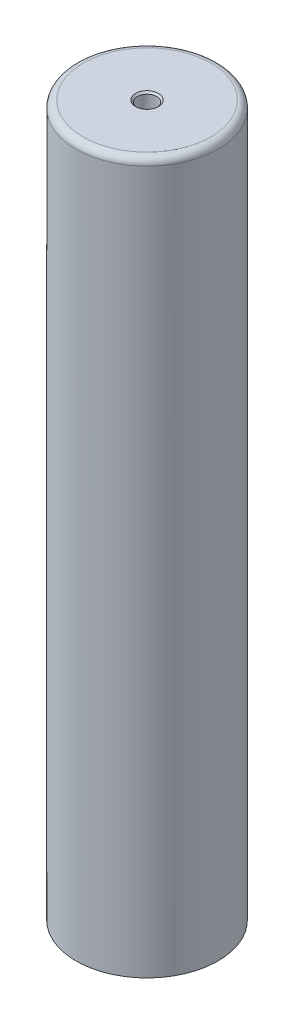
ISO-10303-21;
HEADER;
FILE_DESCRIPTION(('STEP AP214'),'2;1');
FILE_NAME('part.step','',(''),(''),'','','');
FILE_SCHEMA(('AUTOMOTIVE_DESIGN { 1 0 10303 214 1 1 1 1 }'));
ENDSEC;
DATA;
#1=APPLICATION_CONTEXT('core data for automotive mechanical design processes');
#2=APPLICATION_PROTOCOL_DEFINITION('international standard','automotive_design',2000,#1);
#3=PRODUCT_CONTEXT('',#1,'mechanical');
#4=PRODUCT('Part','Part','',(#3));
#5=PRODUCT_RELATED_PRODUCT_CATEGORY('part','',(#4));
#6=PRODUCT_DEFINITION_FORMATION('','',#4);
#7=PRODUCT_DEFINITION_CONTEXT('part definition',#1,'design');
#8=PRODUCT_DEFINITION('design','',#6,#7);
#9=PRODUCT_DEFINITION_SHAPE('','',#8);
#10=(LENGTH_UNIT() NAMED_UNIT(*) SI_UNIT(.MILLI.,.METRE.));
#11=(NAMED_UNIT(*) PLANE_ANGLE_UNIT() SI_UNIT($,.RADIAN.));
#12=(NAMED_UNIT(*) SI_UNIT($,.STERADIAN.) SOLID_ANGLE_UNIT());
#13=UNCERTAINTY_MEASURE_WITH_UNIT(LENGTH_MEASURE(1.E-05),#10,'distance_accuracy_value','');
#14=(GEOMETRIC_REPRESENTATION_CONTEXT(3) GLOBAL_UNCERTAINTY_ASSIGNED_CONTEXT((#13)) GLOBAL_UNIT_ASSIGNED_CONTEXT((#10,
#11,#12)) REPRESENTATION_CONTEXT('',''));
#15=CARTESIAN_POINT('',(0.,0.,0.));
#16=DIRECTION('',(0.,0.,1.));
#17=DIRECTION('',(1.,0.,0.));
#18=AXIS2_PLACEMENT_3D('',#15,#16,#17);
#19=CARTESIAN_POINT('',(0.,250.,0.));
#20=DIRECTION('',(0.,1.,0.));
#21=DIRECTION('',(0.,0.,1.));
#22=AXIS2_PLACEMENT_3D('',#19,#20,#21);
#23=PLANE('',#22);
#24=CARTESIAN_POINT('',(0.,250.,0.));
#25=DIRECTION('',(0.,1.,0.));
#26=DIRECTION('',(0.,0.,1.));
#27=AXIS2_PLACEMENT_3D('',#24,#25,#26);
#28=CIRCLE('',#27,22.4999999999999);
#29=CARTESIAN_POINT('',(0.,250.,22.4999999999999));
#30=VERTEX_POINT('',#29);
#31=EDGE_CURVE('E11',#30,#30,#28,.T.);
#32=ORIENTED_EDGE('',*,*,#31,.T.);
#33=EDGE_LOOP('',(#32));
#34=FACE_BOUND('',#33,.T.);
#35=CARTESIAN_POINT('',(0.,250.,0.));
#36=DIRECTION('',(0.,1.,0.));
#37=DIRECTION('',(0.,0.,1.));
#38=AXIS2_PLACEMENT_3D('',#35,#36,#37);
#39=CIRCLE('',#38,4.025);
#40=CARTESIAN_POINT('',(0.,250.,4.025));
#41=VERTEX_POINT('',#40);
#42=EDGE_CURVE('E65',#41,#41,#39,.T.);
#43=ORIENTED_EDGE('',*,*,#42,.F.);
#44=EDGE_LOOP('',(#43));
#45=FACE_BOUND('',#44,.T.);
#46=ADVANCED_FACE('F39',(#34,#45),#23,.T.);
#47=CARTESIAN_POINT('',(0.,0.,0.));
#48=DIRECTION('',(0.,-1.,0.));
#49=DIRECTION('',(0.,0.,-1.));
#50=AXIS2_PLACEMENT_3D('',#47,#48,#49);
#51=CYLINDRICAL_SURFACE('',#50,24.9999999999999);
#52=CARTESIAN_POINT('',(0.,247.5,0.));
#53=DIRECTION('',(0.,1.,0.));
#54=DIRECTION('',(0.,0.,1.));
#55=AXIS2_PLACEMENT_3D('',#52,#53,#54);
#56=CIRCLE('',#55,24.9999999999999);
#57=CARTESIAN_POINT('',(0.,247.5,24.9999999999999));
#58=VERTEX_POINT('',#57);
#59=EDGE_CURVE('E46',#58,#58,#56,.F.);
#60=ORIENTED_EDGE('',*,*,#59,.T.);
#61=EDGE_LOOP('',(#60));
#62=FACE_BOUND('',#61,.T.);
#63=CARTESIAN_POINT('',(0.,0.,0.));
#64=DIRECTION('',(0.,-1.,0.));
#65=DIRECTION('',(0.,0.,-1.));
#66=AXIS2_PLACEMENT_3D('',#63,#64,#65);
#67=CIRCLE('',#66,24.9999999999998);
#68=CARTESIAN_POINT('',(0.,0.,-24.9999999999998));
#69=VERTEX_POINT('',#68);
#70=EDGE_CURVE('E59',#69,#69,#67,.T.);
#71=ORIENTED_EDGE('',*,*,#70,.F.);
#72=EDGE_LOOP('',(#71));
#73=FACE_BOUND('',#72,.T.);
#74=ADVANCED_FACE('F71',(#62,#73),#51,.T.);
#75=CARTESIAN_POINT('',(24.9999999999998,0.,0.));
#76=DIRECTION('',(0.,-1.,0.));
#77=DIRECTION('',(0.,0.,-1.));
#78=AXIS2_PLACEMENT_3D('',#75,#76,#77);
#79=PLANE('',#78);
#80=ORIENTED_EDGE('',*,*,#70,.T.);
#81=EDGE_LOOP('',(#80));
#82=FACE_BOUND('',#81,.T.);
#83=ADVANCED_FACE('F53',(#82),#79,.T.);
#84=CARTESIAN_POINT('',(0.,233.25,0.));
#85=DIRECTION('',(0.,1.,0.));
#86=DIRECTION('',(0.,0.,1.));
#87=AXIS2_PLACEMENT_3D('',#84,#85,#86);
#88=CONICAL_SURFACE('',#87,3.39999999999999,1.02974425867665);
#89=CARTESIAN_POINT('',(0.,231.207073895306,0.));
#90=VERTEX_POINT('',#89);
#91=VERTEX_LOOP('',#90);
#92=FACE_BOUND('',#91,.T.);
#93=CARTESIAN_POINT('',(0.,233.25,0.));
#94=DIRECTION('',(0.,1.,0.));
#95=DIRECTION('',(0.,0.,1.));
#96=AXIS2_PLACEMENT_3D('',#93,#94,#95);
#97=CIRCLE('',#96,3.39999999999999);
#98=CARTESIAN_POINT('',(0.,233.25,3.39999999999999));
#99=VERTEX_POINT('',#98);
#100=EDGE_CURVE('E57',#99,#99,#97,.T.);
#101=ORIENTED_EDGE('',*,*,#100,.T.);
#102=EDGE_LOOP('',(#101));
#103=FACE_BOUND('',#102,.T.);
#104=ADVANCED_FACE('F49',(#92,#103),#88,.F.);
#105=CARTESIAN_POINT('',(0.,250.,0.));
#106=DIRECTION('',(0.,1.,0.));
#107=DIRECTION('',(0.,0.,1.));
#108=AXIS2_PLACEMENT_3D('',#105,#106,#107);
#109=CYLINDRICAL_SURFACE('',#108,3.39999999999999);
#110=ORIENTED_EDGE('',*,*,#100,.F.);
#111=EDGE_LOOP('',(#110));
#112=FACE_BOUND('',#111,.T.);
#113=CARTESIAN_POINT('',(0.,249.375,0.));
#114=DIRECTION('',(0.,1.,0.));
#115=DIRECTION('',(0.,0.,1.));
#116=AXIS2_PLACEMENT_3D('',#113,#114,#115);
#117=CIRCLE('',#116,3.39999999999999);
#118=CARTESIAN_POINT('',(0.,249.375,3.39999999999999));
#119=VERTEX_POINT('',#118);
#120=EDGE_CURVE('E60',#119,#119,#117,.T.);
#121=ORIENTED_EDGE('',*,*,#120,.T.);
#122=EDGE_LOOP('',(#121));
#123=FACE_BOUND('',#122,.T.);
#124=ADVANCED_FACE('F52',(#112,#123),#109,.F.);
#125=CARTESIAN_POINT('',(0.,250.,0.));
#126=DIRECTION('',(0.,1.,0.));
#127=DIRECTION('',(0.,0.,1.));
#128=AXIS2_PLACEMENT_3D('',#125,#126,#127);
#129=CONICAL_SURFACE('',#128,4.025,0.785398163397447);
#130=ORIENTED_EDGE('',*,*,#120,.F.);
#131=EDGE_LOOP('',(#130));
#132=FACE_BOUND('',#131,.T.);
#133=ORIENTED_EDGE('',*,*,#42,.T.);
#134=EDGE_LOOP('',(#133));
#135=FACE_BOUND('',#134,.T.);
#136=ADVANCED_FACE('F75',(#132,#135),#129,.F.);
#137=CARTESIAN_POINT('',(0.,247.5,0.));
#138=DIRECTION('',(0.,1.,0.));
#139=DIRECTION('',(0.,0.,1.));
#140=AXIS2_PLACEMENT_3D('',#137,#138,#139);
#141=TOROIDAL_SURFACE('',#140,22.4999999999999,2.5);
#142=ORIENTED_EDGE('',*,*,#31,.F.);
#143=EDGE_LOOP('',(#142));
#144=FACE_BOUND('',#143,.T.);
#145=ORIENTED_EDGE('',*,*,#59,.F.);
#146=EDGE_LOOP('',(#145));
#147=FACE_BOUND('',#146,.T.);
#148=ADVANCED_FACE('F41',(#144,#147),#141,.T.);
#149=CLOSED_SHELL('',(#46,#74,#83,#104,#124,#136,#148));
#150=MANIFOLD_SOLID_BREP('B2',#149);
#151=ADVANCED_BREP_SHAPE_REPRESENTATION('',(#18,#150),#14);
#152=SHAPE_DEFINITION_REPRESENTATION(#9,#151);
ENDSEC;
END-ISO-10303-21;
